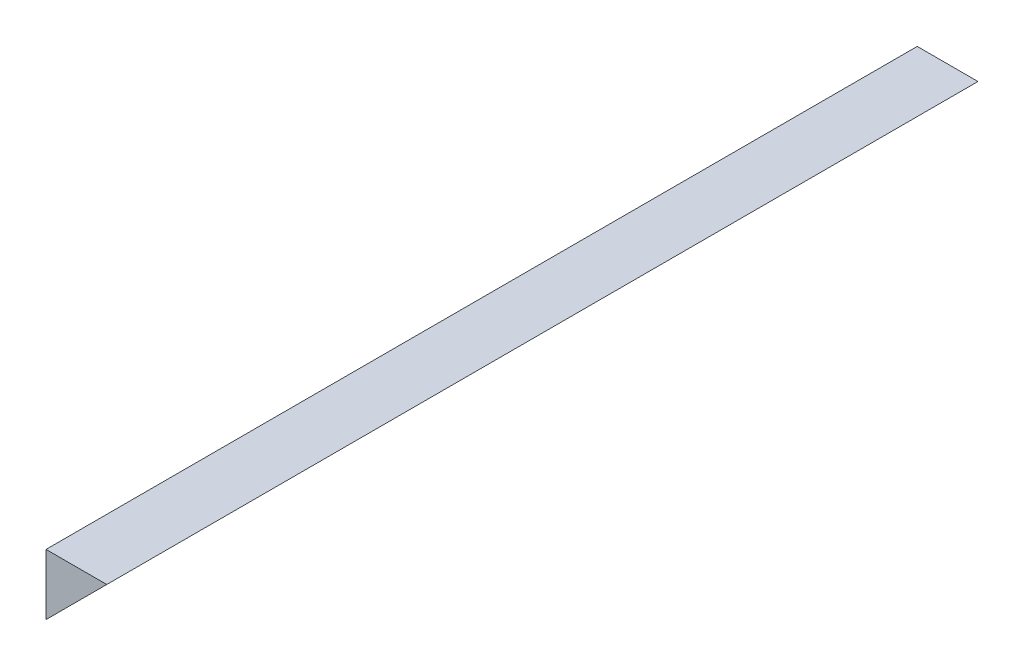
ISO-10303-21;
HEADER;
FILE_DESCRIPTION(('STEP AP214'),'2;1');
FILE_NAME('part.step','',(''),(''),'','','');
FILE_SCHEMA(('AUTOMOTIVE_DESIGN { 1 0 10303 214 1 1 1 1 }'));
ENDSEC;
DATA;
#1=APPLICATION_CONTEXT('core data for automotive mechanical design processes');
#2=APPLICATION_PROTOCOL_DEFINITION('international standard','automotive_design',2000,#1);
#3=PRODUCT_CONTEXT('',#1,'mechanical');
#4=PRODUCT('Part','Part','',(#3));
#5=PRODUCT_RELATED_PRODUCT_CATEGORY('part','',(#4));
#6=PRODUCT_DEFINITION_FORMATION('','',#4);
#7=PRODUCT_DEFINITION_CONTEXT('part definition',#1,'design');
#8=PRODUCT_DEFINITION('design','',#6,#7);
#9=PRODUCT_DEFINITION_SHAPE('','',#8);
#10=(LENGTH_UNIT() NAMED_UNIT(*) SI_UNIT(.MILLI.,.METRE.));
#11=(NAMED_UNIT(*) PLANE_ANGLE_UNIT() SI_UNIT($,.RADIAN.));
#12=(NAMED_UNIT(*) SI_UNIT($,.STERADIAN.) SOLID_ANGLE_UNIT());
#13=UNCERTAINTY_MEASURE_WITH_UNIT(LENGTH_MEASURE(1.E-05),#10,'distance_accuracy_value','');
#14=(GEOMETRIC_REPRESENTATION_CONTEXT(3) GLOBAL_UNCERTAINTY_ASSIGNED_CONTEXT((#13)) GLOBAL_UNIT_ASSIGNED_CONTEXT((#10,
#11,#12)) REPRESENTATION_CONTEXT('',''));
#15=CARTESIAN_POINT('',(0.,0.,0.));
#16=DIRECTION('',(0.,0.,1.));
#17=DIRECTION('',(1.,0.,0.));
#18=AXIS2_PLACEMENT_3D('',#15,#16,#17);
#19=CARTESIAN_POINT('',(-240.,-227.,248.5175));
#20=DIRECTION('',(0.707106781186606,-0.707106781186491,0.));
#21=DIRECTION('',(0.707106781186491,0.707106781186606,0.));
#22=AXIS2_PLACEMENT_3D('',#19,#20,#21);
#23=PLANE('',#22);
#24=DIRECTION('',(-0.707106781186491,-0.707106781186606,0.));
#25=VECTOR('',#24,1.);
#26=CARTESIAN_POINT('',(-245.661611652385,-232.661611652386,224.5));
#27=LINE('',#26,#25);
#28=CARTESIAN_POINT('',(-245.000000000065,-232.000000000066,224.5));
#29=VERTEX_POINT('',#28);
#30=CARTESIAN_POINT('',(-246.500000000043,-233.500000000066,224.5));
#31=VERTEX_POINT('',#30);
#32=EDGE_CURVE('E57',#29,#31,#27,.T.);
#33=ORIENTED_EDGE('',*,*,#32,.F.);
#34=DIRECTION('',(0.,0.,1.));
#35=VECTOR('',#34,1.);
#36=CARTESIAN_POINT('',(-245.000000000065,-232.000000000066,248.5));
#37=LINE('',#36,#35);
#38=CARTESIAN_POINT('',(-245.000000000043,-232.000000000066,246.));
#39=VERTEX_POINT('',#38);
#40=EDGE_CURVE('E20',#29,#39,#37,.T.);
#41=ORIENTED_EDGE('',*,*,#40,.T.);
#42=DIRECTION('',(0.707106781186491,0.707106781186606,0.));
#43=VECTOR('',#42,1.);
#44=CARTESIAN_POINT('',(-246.500000000043,-233.500000000066,246.));
#45=LINE('',#44,#43);
#46=CARTESIAN_POINT('',(-246.500000000043,-233.500000000066,246.));
#47=VERTEX_POINT('',#46);
#48=EDGE_CURVE('E51',#47,#39,#45,.T.);
#49=ORIENTED_EDGE('',*,*,#48,.F.);
#50=DIRECTION('',(0.,0.,1.));
#51=VECTOR('',#50,1.);
#52=CARTESIAN_POINT('',(-246.500000000043,-233.500000000066,224.5));
#53=LINE('',#52,#51);
#54=EDGE_CURVE('E44',#31,#47,#53,.T.);
#55=ORIENTED_EDGE('',*,*,#54,.F.);
#56=EDGE_LOOP('',(#33,#41,#49,#55));
#57=FACE_BOUND('',#56,.T.);
#58=ADVANCED_FACE('F16',(#57),#23,.T.);
#59=CARTESIAN_POINT('',(-244.823223304705,-233.500000000066,224.5));
#60=DIRECTION('',(0.,0.,-1.));
#61=DIRECTION('',(-1.,0.,0.));
#62=AXIS2_PLACEMENT_3D('',#59,#60,#61);
#63=PLANE('',#62);
#64=DIRECTION('',(-1.,0.,0.));
#65=VECTOR('',#64,1.);
#66=CARTESIAN_POINT('',(-244.823223304705,-232.000000000066,224.5));
#67=LINE('',#66,#65);
#68=CARTESIAN_POINT('',(-246.500000000043,-232.000000000066,224.5));
#69=VERTEX_POINT('',#68);
#70=EDGE_CURVE('E11',#29,#69,#67,.T.);
#71=ORIENTED_EDGE('',*,*,#70,.F.);
#72=ORIENTED_EDGE('',*,*,#32,.T.);
#73=DIRECTION('',(0.,1.,0.));
#74=VECTOR('',#73,1.);
#75=CARTESIAN_POINT('',(-246.500000000043,-233.500000000066,224.5));
#76=LINE('',#75,#74);
#77=EDGE_CURVE('E64',#31,#69,#76,.T.);
#78=ORIENTED_EDGE('',*,*,#77,.T.);
#79=EDGE_LOOP('',(#71,#72,#78));
#80=FACE_BOUND('',#79,.T.);
#81=ADVANCED_FACE('F63',(#80),#63,.T.);
#82=CARTESIAN_POINT('',(-2860.00000000001,-231.999999999993,248.5));
#83=DIRECTION('',(0.,-1.,0.));
#84=DIRECTION('',(1.,0.,0.));
#85=AXIS2_PLACEMENT_3D('',#82,#83,#84);
#86=PLANE('',#85);
#87=ORIENTED_EDGE('',*,*,#40,.F.);
#88=ORIENTED_EDGE('',*,*,#70,.T.);
#89=DIRECTION('',(0.,0.,1.));
#90=VECTOR('',#89,1.);
#91=CARTESIAN_POINT('',(-246.500000000043,-232.000000000066,224.5));
#92=LINE('',#91,#90);
#93=CARTESIAN_POINT('',(-246.500000000043,-232.000000000066,246.));
#94=VERTEX_POINT('',#93);
#95=EDGE_CURVE('E26',#69,#94,#92,.T.);
#96=ORIENTED_EDGE('',*,*,#95,.T.);
#97=DIRECTION('',(1.,0.,0.));
#98=VECTOR('',#97,1.);
#99=CARTESIAN_POINT('',(-246.500000000043,-232.000000000066,246.));
#100=LINE('',#99,#98);
#101=EDGE_CURVE('E62',#94,#39,#100,.T.);
#102=ORIENTED_EDGE('',*,*,#101,.T.);
#103=EDGE_LOOP('',(#87,#88,#96,#102));
#104=FACE_BOUND('',#103,.T.);
#105=ADVANCED_FACE('F61',(#104),#86,.F.);
#106=CARTESIAN_POINT('',(-246.500000000043,-233.500000000066,224.5));
#107=DIRECTION('',(-1.,0.,0.));
#108=DIRECTION('',(0.,-1.,0.));
#109=AXIS2_PLACEMENT_3D('',#106,#107,#108);
#110=PLANE('',#109);
#111=ORIENTED_EDGE('',*,*,#95,.F.);
#112=ORIENTED_EDGE('',*,*,#77,.F.);
#113=ORIENTED_EDGE('',*,*,#54,.T.);
#114=DIRECTION('',(0.,1.,0.));
#115=VECTOR('',#114,1.);
#116=CARTESIAN_POINT('',(-246.500000000043,-233.500000000066,246.));
#117=LINE('',#116,#115);
#118=EDGE_CURVE('E66',#47,#94,#117,.T.);
#119=ORIENTED_EDGE('',*,*,#118,.T.);
#120=EDGE_LOOP('',(#111,#112,#113,#119));
#121=FACE_BOUND('',#120,.T.);
#122=ADVANCED_FACE('F68',(#121),#110,.T.);
#123=CARTESIAN_POINT('',(-246.500000000043,-233.500000000066,246.));
#124=DIRECTION('',(0.,0.,1.));
#125=DIRECTION('',(1.,0.,0.));
#126=AXIS2_PLACEMENT_3D('',#123,#124,#125);
#127=PLANE('',#126);
#128=ORIENTED_EDGE('',*,*,#118,.F.);
#129=ORIENTED_EDGE('',*,*,#48,.T.);
#130=ORIENTED_EDGE('',*,*,#101,.F.);
#131=EDGE_LOOP('',(#128,#129,#130));
#132=FACE_BOUND('',#131,.T.);
#133=ADVANCED_FACE('F18',(#132),#127,.T.);
#134=CLOSED_SHELL('',(#58,#81,#105,#122,#133));
#135=MANIFOLD_SOLID_BREP('B1',#134);
#136=ADVANCED_BREP_SHAPE_REPRESENTATION('',(#18,#135),#14);
#137=SHAPE_DEFINITION_REPRESENTATION(#9,#136);
ENDSEC;
END-ISO-10303-21;
